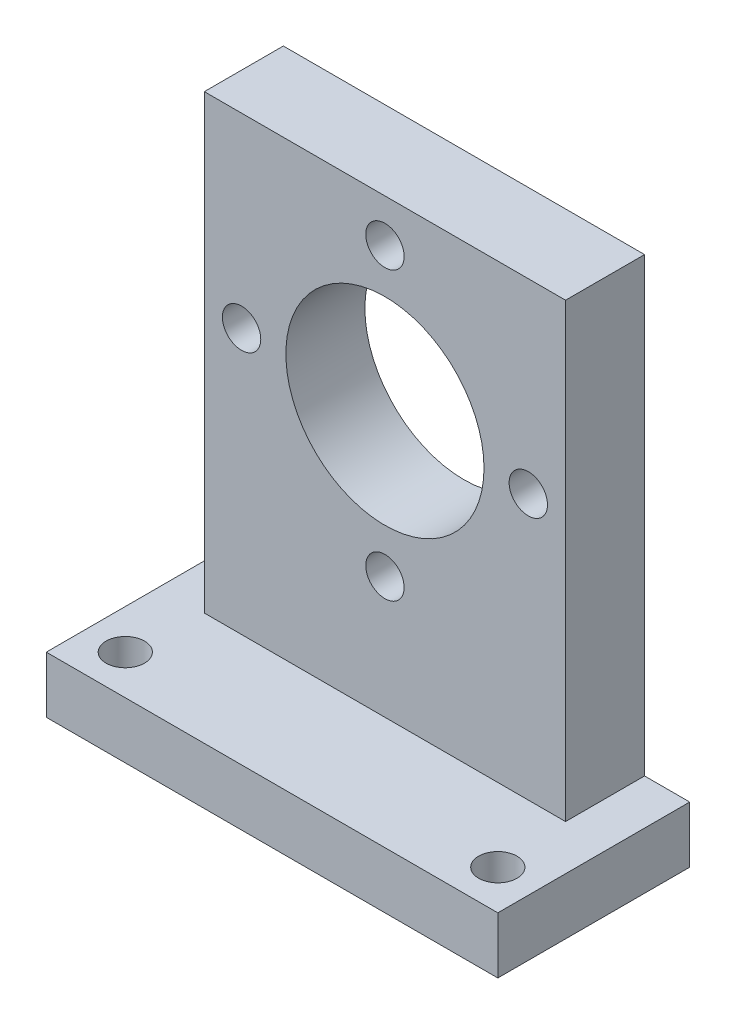
ISO-10303-21;
HEADER;
FILE_DESCRIPTION(('STEP AP214'),'2;1');
FILE_NAME('part.step','',(''),(''),'','','');
FILE_SCHEMA(('AUTOMOTIVE_DESIGN { 1 0 10303 214 1 1 1 1 }'));
ENDSEC;
DATA;
#1=APPLICATION_CONTEXT('core data for automotive mechanical design processes');
#2=APPLICATION_PROTOCOL_DEFINITION('international standard','automotive_design',2000,#1);
#3=PRODUCT_CONTEXT('',#1,'mechanical');
#4=PRODUCT('Part','Part','',(#3));
#5=PRODUCT_RELATED_PRODUCT_CATEGORY('part','',(#4));
#6=PRODUCT_DEFINITION_FORMATION('','',#4);
#7=PRODUCT_DEFINITION_CONTEXT('part definition',#1,'design');
#8=PRODUCT_DEFINITION('design','',#6,#7);
#9=PRODUCT_DEFINITION_SHAPE('','',#8);
#10=(LENGTH_UNIT() NAMED_UNIT(*) SI_UNIT(.MILLI.,.METRE.));
#11=(NAMED_UNIT(*) PLANE_ANGLE_UNIT() SI_UNIT($,.RADIAN.));
#12=(NAMED_UNIT(*) SI_UNIT($,.STERADIAN.) SOLID_ANGLE_UNIT());
#13=UNCERTAINTY_MEASURE_WITH_UNIT(LENGTH_MEASURE(1.E-05),#10,'distance_accuracy_value','');
#14=(GEOMETRIC_REPRESENTATION_CONTEXT(3) GLOBAL_UNCERTAINTY_ASSIGNED_CONTEXT((#13)) GLOBAL_UNIT_ASSIGNED_CONTEXT((#10,
#11,#12)) REPRESENTATION_CONTEXT('',''));
#15=CARTESIAN_POINT('',(0.,0.,0.));
#16=DIRECTION('',(0.,0.,1.));
#17=DIRECTION('',(1.,0.,0.));
#18=AXIS2_PLACEMENT_3D('',#15,#16,#17);
#19=CARTESIAN_POINT('',(-20.,5.,13.5));
#20=DIRECTION('',(0.,0.,-1.));
#21=DIRECTION('',(-1.,0.,0.));
#22=AXIS2_PLACEMENT_3D('',#19,#20,#21);
#23=PLANE('',#22);
#24=DIRECTION('',(1.,0.,0.));
#25=VECTOR('',#24,1.);
#26=CARTESIAN_POINT('',(-20.,0.,13.5));
#27=LINE('',#26,#25);
#28=CARTESIAN_POINT('',(-20.,0.,13.5));
#29=VERTEX_POINT('',#28);
#30=CARTESIAN_POINT('',(20.,0.,13.5));
#31=VERTEX_POINT('',#30);
#32=EDGE_CURVE('E121',#29,#31,#27,.T.);
#33=ORIENTED_EDGE('',*,*,#32,.T.);
#34=DIRECTION('',(0.,-1.,0.));
#35=VECTOR('',#34,1.);
#36=CARTESIAN_POINT('',(20.,5.,13.5));
#37=LINE('',#36,#35);
#38=CARTESIAN_POINT('',(20.,5.,13.5));
#39=VERTEX_POINT('',#38);
#40=EDGE_CURVE('E12',#39,#31,#37,.T.);
#41=ORIENTED_EDGE('',*,*,#40,.F.);
#42=DIRECTION('',(1.,0.,0.));
#43=VECTOR('',#42,1.);
#44=CARTESIAN_POINT('',(-20.,5.,13.5));
#45=LINE('',#44,#43);
#46=CARTESIAN_POINT('',(-20.,5.,13.5));
#47=VERTEX_POINT('',#46);
#48=EDGE_CURVE('E115',#47,#39,#45,.T.);
#49=ORIENTED_EDGE('',*,*,#48,.F.);
#50=DIRECTION('',(0.,-1.,0.));
#51=VECTOR('',#50,1.);
#52=CARTESIAN_POINT('',(-20.,5.,13.5));
#53=LINE('',#52,#51);
#54=EDGE_CURVE('E75',#47,#29,#53,.T.);
#55=ORIENTED_EDGE('',*,*,#54,.T.);
#56=EDGE_LOOP('',(#33,#41,#49,#55));
#57=FACE_BOUND('',#56,.T.);
#58=ADVANCED_FACE('F67',(#57),#23,.F.);
#59=CARTESIAN_POINT('',(20.,5.,-13.5));
#60=DIRECTION('',(1.,0.,0.));
#61=DIRECTION('',(0.,0.,-1.));
#62=AXIS2_PLACEMENT_3D('',#59,#60,#61);
#63=PLANE('',#62);
#64=DIRECTION('',(0.,1.,0.));
#65=VECTOR('',#64,1.);
#66=CARTESIAN_POINT('',(20.,-0.00100000000000013,-3.5));
#67=LINE('',#66,#65);
#68=CARTESIAN_POINT('',(20.,0.,-3.5));
#69=VERTEX_POINT('',#68);
#70=CARTESIAN_POINT('',(20.,5.,-3.5));
#71=VERTEX_POINT('',#70);
#72=EDGE_CURVE('E237',#69,#71,#67,.T.);
#73=ORIENTED_EDGE('',*,*,#72,.T.);
#74=DIRECTION('',(0.,0.,1.));
#75=VECTOR('',#74,1.);
#76=CARTESIAN_POINT('',(20.,5.,-13.5));
#77=LINE('',#76,#75);
#78=EDGE_CURVE('E136',#71,#39,#77,.T.);
#79=ORIENTED_EDGE('',*,*,#78,.T.);
#80=ORIENTED_EDGE('',*,*,#40,.T.);
#81=DIRECTION('',(0.,0.,1.));
#82=VECTOR('',#81,1.);
#83=CARTESIAN_POINT('',(20.,0.,-13.5));
#84=LINE('',#83,#82);
#85=EDGE_CURVE('E116',#69,#31,#84,.T.);
#86=ORIENTED_EDGE('',*,*,#85,.F.);
#87=EDGE_LOOP('',(#73,#79,#80,#86));
#88=FACE_BOUND('',#87,.T.);
#89=ADVANCED_FACE('F281',(#88),#63,.T.);
#90=CARTESIAN_POINT('',(-20.,5.,-13.5));
#91=DIRECTION('',(1.,0.,0.));
#92=DIRECTION('',(0.,0.,-1.));
#93=AXIS2_PLACEMENT_3D('',#90,#91,#92);
#94=PLANE('',#93);
#95=DIRECTION('',(0.,0.,1.));
#96=VECTOR('',#95,1.);
#97=CARTESIAN_POINT('',(-20.,5.,-13.5));
#98=LINE('',#97,#96);
#99=CARTESIAN_POINT('',(-20.,5.,-3.5));
#100=VERTEX_POINT('',#99);
#101=EDGE_CURVE('E90',#100,#47,#98,.T.);
#102=ORIENTED_EDGE('',*,*,#101,.F.);
#103=DIRECTION('',(0.,1.,0.));
#104=VECTOR('',#103,1.);
#105=CARTESIAN_POINT('',(-20.,-0.00100000000000013,-3.5));
#106=LINE('',#105,#104);
#107=CARTESIAN_POINT('',(-20.,0.,-3.5));
#108=VERTEX_POINT('',#107);
#109=EDGE_CURVE('E110',#108,#100,#106,.T.);
#110=ORIENTED_EDGE('',*,*,#109,.F.);
#111=DIRECTION('',(0.,0.,1.));
#112=VECTOR('',#111,1.);
#113=CARTESIAN_POINT('',(-20.,0.,-13.5));
#114=LINE('',#113,#112);
#115=EDGE_CURVE('E104',#108,#29,#114,.T.);
#116=ORIENTED_EDGE('',*,*,#115,.T.);
#117=ORIENTED_EDGE('',*,*,#54,.F.);
#118=EDGE_LOOP('',(#102,#110,#116,#117));
#119=FACE_BOUND('',#118,.T.);
#120=ADVANCED_FACE('F106',(#119),#94,.F.);
#121=CARTESIAN_POINT('',(0.,5.,0.));
#122=DIRECTION('',(0.,-1.,0.));
#123=DIRECTION('',(0.,0.,-1.));
#124=AXIS2_PLACEMENT_3D('',#121,#122,#123);
#125=PLANE('',#124);
#126=CARTESIAN_POINT('',(16.5,5.,10.));
#127=DIRECTION('',(0.,1.,0.));
#128=DIRECTION('',(0.,0.,-1.));
#129=AXIS2_PLACEMENT_3D('',#126,#127,#128);
#130=CIRCLE('',#129,1.7);
#131=CARTESIAN_POINT('',(16.5,5.,8.3));
#132=VERTEX_POINT('',#131);
#133=EDGE_CURVE('E219',#132,#132,#130,.T.);
#134=ORIENTED_EDGE('',*,*,#133,.F.);
#135=EDGE_LOOP('',(#134));
#136=FACE_BOUND('',#135,.T.);
#137=CARTESIAN_POINT('',(-16.5,5.,10.));
#138=DIRECTION('',(0.,1.,0.));
#139=DIRECTION('',(0.,0.,1.));
#140=AXIS2_PLACEMENT_3D('',#137,#138,#139);
#141=CIRCLE('',#140,1.7);
#142=CARTESIAN_POINT('',(-16.5,5.,11.7));
#143=VERTEX_POINT('',#142);
#144=EDGE_CURVE('E228',#143,#143,#141,.T.);
#145=ORIENTED_EDGE('',*,*,#144,.F.);
#146=EDGE_LOOP('',(#145));
#147=FACE_BOUND('',#146,.T.);
#148=ORIENTED_EDGE('',*,*,#78,.F.);
#149=DIRECTION('',(1.,0.,0.));
#150=VECTOR('',#149,1.);
#151=CARTESIAN_POINT('',(-20.,5.,-3.5));
#152=LINE('',#151,#150);
#153=CARTESIAN_POINT('',(16.,5.,-3.5));
#154=VERTEX_POINT('',#153);
#155=EDGE_CURVE('E247',#154,#71,#152,.T.);
#156=ORIENTED_EDGE('',*,*,#155,.F.);
#157=DIRECTION('',(0.,0.,1.));
#158=VECTOR('',#157,1.);
#159=CARTESIAN_POINT('',(16.,5.,0.));
#160=LINE('',#159,#158);
#161=CARTESIAN_POINT('',(16.,5.00000000000001,3.5));
#162=VERTEX_POINT('',#161);
#163=EDGE_CURVE('E143',#154,#162,#160,.T.);
#164=ORIENTED_EDGE('',*,*,#163,.T.);
#165=DIRECTION('',(1.,0.,0.));
#166=VECTOR('',#165,1.);
#167=CARTESIAN_POINT('',(0.,5.,3.5));
#168=LINE('',#167,#166);
#169=CARTESIAN_POINT('',(-16.,5.,3.5));
#170=VERTEX_POINT('',#169);
#171=EDGE_CURVE('E82',#170,#162,#168,.T.);
#172=ORIENTED_EDGE('',*,*,#171,.F.);
#173=DIRECTION('',(0.,0.,1.));
#174=VECTOR('',#173,1.);
#175=CARTESIAN_POINT('',(-16.,5.,0.));
#176=LINE('',#175,#174);
#177=CARTESIAN_POINT('',(-16.,5.,-3.5));
#178=VERTEX_POINT('',#177);
#179=EDGE_CURVE('E131',#178,#170,#176,.T.);
#180=ORIENTED_EDGE('',*,*,#179,.F.);
#181=EDGE_CURVE('E240',#100,#178,#152,.T.);
#182=ORIENTED_EDGE('',*,*,#181,.F.);
#183=ORIENTED_EDGE('',*,*,#101,.T.);
#184=ORIENTED_EDGE('',*,*,#48,.T.);
#185=EDGE_LOOP('',(#148,#156,#164,#172,#180,#182,#183,#184));
#186=FACE_BOUND('',#185,.T.);
#187=ADVANCED_FACE('F282',(#136,#147,#186),#125,.F.);
#188=CARTESIAN_POINT('',(0.,0.,0.));
#189=DIRECTION('',(0.,-1.,0.));
#190=DIRECTION('',(0.,0.,-1.));
#191=AXIS2_PLACEMENT_3D('',#188,#189,#190);
#192=PLANE('',#191);
#193=DIRECTION('',(1.,0.,0.));
#194=VECTOR('',#193,1.);
#195=CARTESIAN_POINT('',(-20.,0.,-3.5));
#196=LINE('',#195,#194);
#197=EDGE_CURVE('E224',#108,#69,#196,.T.);
#198=ORIENTED_EDGE('',*,*,#197,.T.);
#199=ORIENTED_EDGE('',*,*,#85,.T.);
#200=ORIENTED_EDGE('',*,*,#32,.F.);
#201=ORIENTED_EDGE('',*,*,#115,.F.);
#202=EDGE_LOOP('',(#198,#199,#200,#201));
#203=FACE_BOUND('',#202,.T.);
#204=CARTESIAN_POINT('',(16.5,0.,10.));
#205=DIRECTION('',(0.,-1.,0.));
#206=DIRECTION('',(0.,0.,-1.));
#207=AXIS2_PLACEMENT_3D('',#204,#205,#206);
#208=CIRCLE('',#207,1.7);
#209=CARTESIAN_POINT('',(16.5,0.,8.3));
#210=VERTEX_POINT('',#209);
#211=EDGE_CURVE('E223',#210,#210,#208,.F.);
#212=ORIENTED_EDGE('',*,*,#211,.T.);
#213=EDGE_LOOP('',(#212));
#214=FACE_BOUND('',#213,.T.);
#215=CARTESIAN_POINT('',(-16.5,0.,10.));
#216=DIRECTION('',(0.,-1.,0.));
#217=DIRECTION('',(0.,0.,-1.));
#218=AXIS2_PLACEMENT_3D('',#215,#216,#217);
#219=CIRCLE('',#218,1.7);
#220=CARTESIAN_POINT('',(-16.5,0.,8.30000000000001));
#221=VERTEX_POINT('',#220);
#222=EDGE_CURVE('E192',#221,#221,#219,.F.);
#223=ORIENTED_EDGE('',*,*,#222,.T.);
#224=EDGE_LOOP('',(#223));
#225=FACE_BOUND('',#224,.T.);
#226=ADVANCED_FACE('F123',(#203,#214,#225),#192,.T.);
#227=CARTESIAN_POINT('',(0.,45.,-3.5));
#228=DIRECTION('',(0.,0.,-1.));
#229=DIRECTION('',(-1.,0.,0.));
#230=AXIS2_PLACEMENT_3D('',#227,#228,#229);
#231=PLANE('',#230);
#232=CARTESIAN_POINT('',(12.7000000000002,2.5,-3.5));
#233=DIRECTION('',(0.,0.,-1.));
#234=DIRECTION('',(-1.,0.,0.));
#235=AXIS2_PLACEMENT_3D('',#232,#233,#234);
#236=CIRCLE('',#235,1.7);
#237=CARTESIAN_POINT('',(11.0000000000002,2.5,-3.5));
#238=VERTEX_POINT('',#237);
#239=EDGE_CURVE('E256',#238,#238,#236,.T.);
#240=ORIENTED_EDGE('',*,*,#239,.F.);
#241=EDGE_LOOP('',(#240));
#242=FACE_BOUND('',#241,.T.);
#243=CARTESIAN_POINT('',(-12.7000000000002,2.5,-3.5));
#244=DIRECTION('',(0.,0.,-1.));
#245=DIRECTION('',(1.,0.,0.));
#246=AXIS2_PLACEMENT_3D('',#243,#244,#245);
#247=CIRCLE('',#246,1.7);
#248=CARTESIAN_POINT('',(-11.0000000000002,2.5,-3.5));
#249=VERTEX_POINT('',#248);
#250=EDGE_CURVE('E252',#249,#249,#247,.T.);
#251=ORIENTED_EDGE('',*,*,#250,.F.);
#252=EDGE_LOOP('',(#251));
#253=FACE_BOUND('',#252,.T.);
#254=CARTESIAN_POINT('',(0.,41.2,-3.5));
#255=DIRECTION('',(0.,0.,-1.));
#256=DIRECTION('',(-1.,0.,0.));
#257=AXIS2_PLACEMENT_3D('',#254,#255,#256);
#258=CIRCLE('',#257,1.7);
#259=CARTESIAN_POINT('',(-1.7,41.2,-3.5));
#260=VERTEX_POINT('',#259);
#261=EDGE_CURVE('E212',#260,#260,#258,.F.);
#262=ORIENTED_EDGE('',*,*,#261,.T.);
#263=EDGE_LOOP('',(#262));
#264=FACE_BOUND('',#263,.T.);
#265=CARTESIAN_POINT('',(12.7000000000002,28.5000000000001,-3.5));
#266=DIRECTION('',(0.,0.,-1.));
#267=DIRECTION('',(-1.,0.,0.));
#268=AXIS2_PLACEMENT_3D('',#265,#266,#267);
#269=CIRCLE('',#268,1.7);
#270=CARTESIAN_POINT('',(11.0000000000002,28.5000000000001,-3.5));
#271=VERTEX_POINT('',#270);
#272=EDGE_CURVE('E208',#271,#271,#269,.F.);
#273=ORIENTED_EDGE('',*,*,#272,.T.);
#274=EDGE_LOOP('',(#273));
#275=FACE_BOUND('',#274,.T.);
#276=CARTESIAN_POINT('',(2.66516243803523E-13,15.8,-3.5));
#277=DIRECTION('',(0.,0.,-1.));
#278=DIRECTION('',(-1.,0.,0.));
#279=AXIS2_PLACEMENT_3D('',#276,#277,#278);
#280=CIRCLE('',#279,1.7);
#281=CARTESIAN_POINT('',(-1.69999999999973,15.8,-3.5));
#282=VERTEX_POINT('',#281);
#283=EDGE_CURVE('E200',#282,#282,#280,.F.);
#284=ORIENTED_EDGE('',*,*,#283,.T.);
#285=EDGE_LOOP('',(#284));
#286=FACE_BOUND('',#285,.T.);
#287=CARTESIAN_POINT('',(-12.6999999999998,28.5,-3.5));
#288=DIRECTION('',(0.,0.,-1.));
#289=DIRECTION('',(-1.,0.,0.));
#290=AXIS2_PLACEMENT_3D('',#287,#288,#289);
#291=CIRCLE('',#290,1.7);
#292=CARTESIAN_POINT('',(-14.3999999999998,28.5,-3.5));
#293=VERTEX_POINT('',#292);
#294=EDGE_CURVE('E191',#293,#293,#291,.F.);
#295=ORIENTED_EDGE('',*,*,#294,.T.);
#296=EDGE_LOOP('',(#295));
#297=FACE_BOUND('',#296,.T.);
#298=CARTESIAN_POINT('',(0.,28.5,-3.5));
#299=DIRECTION('',(0.,0.,-1.));
#300=DIRECTION('',(-1.,0.,0.));
#301=AXIS2_PLACEMENT_3D('',#298,#299,#300);
#302=CIRCLE('',#301,8.7757);
#303=CARTESIAN_POINT('',(-8.7757,28.5,-3.5));
#304=VERTEX_POINT('',#303);
#305=EDGE_CURVE('E179',#304,#304,#302,.F.);
#306=ORIENTED_EDGE('',*,*,#305,.T.);
#307=EDGE_LOOP('',(#306));
#308=FACE_BOUND('',#307,.T.);
#309=DIRECTION('',(0.,-1.,0.));
#310=VECTOR('',#309,1.);
#311=CARTESIAN_POINT('',(16.,45.,-3.5));
#312=LINE('',#311,#310);
#313=CARTESIAN_POINT('',(16.,45.,-3.5));
#314=VERTEX_POINT('',#313);
#315=EDGE_CURVE('E146',#314,#154,#312,.T.);
#316=ORIENTED_EDGE('',*,*,#315,.T.);
#317=ORIENTED_EDGE('',*,*,#155,.T.);
#318=ORIENTED_EDGE('',*,*,#72,.F.);
#319=ORIENTED_EDGE('',*,*,#197,.F.);
#320=ORIENTED_EDGE('',*,*,#109,.T.);
#321=ORIENTED_EDGE('',*,*,#181,.T.);
#322=DIRECTION('',(0.,-1.,0.));
#323=VECTOR('',#322,1.);
#324=CARTESIAN_POINT('',(-16.,45.,-3.5));
#325=LINE('',#324,#323);
#326=CARTESIAN_POINT('',(-16.,45.,-3.5));
#327=VERTEX_POINT('',#326);
#328=EDGE_CURVE('E150',#327,#178,#325,.T.);
#329=ORIENTED_EDGE('',*,*,#328,.F.);
#330=DIRECTION('',(1.,0.,0.));
#331=VECTOR('',#330,1.);
#332=CARTESIAN_POINT('',(0.,45.,-3.5));
#333=LINE('',#332,#331);
#334=EDGE_CURVE('E170',#327,#314,#333,.T.);
#335=ORIENTED_EDGE('',*,*,#334,.T.);
#336=EDGE_LOOP('',(#316,#317,#318,#319,#320,#321,#329,#335));
#337=FACE_BOUND('',#336,.T.);
#338=ADVANCED_FACE('F271',(#242,#253,#264,#275,#286,#297,#308,#337),#231,.T.);
#339=CARTESIAN_POINT('',(0.,45.,3.5));
#340=DIRECTION('',(0.,0.,-1.));
#341=DIRECTION('',(-1.,0.,0.));
#342=AXIS2_PLACEMENT_3D('',#339,#340,#341);
#343=PLANE('',#342);
#344=CARTESIAN_POINT('',(0.,41.2,3.5));
#345=DIRECTION('',(0.,0.,1.));
#346=DIRECTION('',(1.,0.,0.));
#347=AXIS2_PLACEMENT_3D('',#344,#345,#346);
#348=CIRCLE('',#347,1.7);
#349=CARTESIAN_POINT('',(1.7,41.2,3.5));
#350=VERTEX_POINT('',#349);
#351=EDGE_CURVE('E183',#350,#350,#348,.T.);
#352=ORIENTED_EDGE('',*,*,#351,.F.);
#353=EDGE_LOOP('',(#352));
#354=FACE_BOUND('',#353,.T.);
#355=CARTESIAN_POINT('',(12.7000000000002,28.5000000000001,3.5));
#356=DIRECTION('',(0.,0.,1.));
#357=DIRECTION('',(1.,0.,0.));
#358=AXIS2_PLACEMENT_3D('',#355,#356,#357);
#359=CIRCLE('',#358,1.7);
#360=CARTESIAN_POINT('',(14.4000000000002,28.5000000000001,3.5));
#361=VERTEX_POINT('',#360);
#362=EDGE_CURVE('E204',#361,#361,#359,.T.);
#363=ORIENTED_EDGE('',*,*,#362,.F.);
#364=EDGE_LOOP('',(#363));
#365=FACE_BOUND('',#364,.T.);
#366=CARTESIAN_POINT('',(2.66516243803523E-13,15.8,3.5));
#367=DIRECTION('',(0.,0.,1.));
#368=DIRECTION('',(1.,0.,0.));
#369=AXIS2_PLACEMENT_3D('',#366,#367,#368);
#370=CIRCLE('',#369,1.7);
#371=CARTESIAN_POINT('',(1.70000000000027,15.8,3.5));
#372=VERTEX_POINT('',#371);
#373=EDGE_CURVE('E196',#372,#372,#370,.T.);
#374=ORIENTED_EDGE('',*,*,#373,.F.);
#375=EDGE_LOOP('',(#374));
#376=FACE_BOUND('',#375,.T.);
#377=CARTESIAN_POINT('',(-12.6999999999998,28.5,3.5));
#378=DIRECTION('',(0.,0.,1.));
#379=DIRECTION('',(1.,0.,0.));
#380=AXIS2_PLACEMENT_3D('',#377,#378,#379);
#381=CIRCLE('',#380,1.7);
#382=CARTESIAN_POINT('',(-10.9999999999998,28.5,3.5));
#383=VERTEX_POINT('',#382);
#384=EDGE_CURVE('E187',#383,#383,#381,.T.);
#385=ORIENTED_EDGE('',*,*,#384,.F.);
#386=EDGE_LOOP('',(#385));
#387=FACE_BOUND('',#386,.T.);
#388=CARTESIAN_POINT('',(0.,28.5,3.5));
#389=DIRECTION('',(0.,0.,1.));
#390=DIRECTION('',(1.,0.,0.));
#391=AXIS2_PLACEMENT_3D('',#388,#389,#390);
#392=CIRCLE('',#391,8.7757);
#393=CARTESIAN_POINT('',(8.7757,28.5,3.5));
#394=VERTEX_POINT('',#393);
#395=EDGE_CURVE('E178',#394,#394,#392,.T.);
#396=ORIENTED_EDGE('',*,*,#395,.F.);
#397=EDGE_LOOP('',(#396));
#398=FACE_BOUND('',#397,.T.);
#399=DIRECTION('',(0.,-1.,0.));
#400=VECTOR('',#399,1.);
#401=CARTESIAN_POINT('',(-16.,45.,3.5));
#402=LINE('',#401,#400);
#403=CARTESIAN_POINT('',(-16.,45.,3.5));
#404=VERTEX_POINT('',#403);
#405=EDGE_CURVE('E154',#404,#170,#402,.T.);
#406=ORIENTED_EDGE('',*,*,#405,.T.);
#407=ORIENTED_EDGE('',*,*,#171,.T.);
#408=DIRECTION('',(0.,-1.,0.));
#409=VECTOR('',#408,1.);
#410=CARTESIAN_POINT('',(16.,45.,3.5));
#411=LINE('',#410,#409);
#412=CARTESIAN_POINT('',(16.,45.,3.5));
#413=VERTEX_POINT('',#412);
#414=EDGE_CURVE('E158',#413,#162,#411,.T.);
#415=ORIENTED_EDGE('',*,*,#414,.F.);
#416=DIRECTION('',(1.,0.,0.));
#417=VECTOR('',#416,1.);
#418=CARTESIAN_POINT('',(0.,45.,3.5));
#419=LINE('',#418,#417);
#420=EDGE_CURVE('E162',#404,#413,#419,.T.);
#421=ORIENTED_EDGE('',*,*,#420,.F.);
#422=EDGE_LOOP('',(#406,#407,#415,#421));
#423=FACE_BOUND('',#422,.T.);
#424=ADVANCED_FACE('F332',(#354,#365,#376,#387,#398,#423),#343,.F.);
#425=CARTESIAN_POINT('',(16.,45.,0.));
#426=DIRECTION('',(1.,0.,0.));
#427=DIRECTION('',(0.,0.,-1.));
#428=AXIS2_PLACEMENT_3D('',#425,#426,#427);
#429=PLANE('',#428);
#430=ORIENTED_EDGE('',*,*,#163,.F.);
#431=ORIENTED_EDGE('',*,*,#315,.F.);
#432=DIRECTION('',(0.,0.,1.));
#433=VECTOR('',#432,1.);
#434=CARTESIAN_POINT('',(16.,45.,0.));
#435=LINE('',#434,#433);
#436=EDGE_CURVE('E174',#314,#413,#435,.T.);
#437=ORIENTED_EDGE('',*,*,#436,.T.);
#438=ORIENTED_EDGE('',*,*,#414,.T.);
#439=EDGE_LOOP('',(#430,#431,#437,#438));
#440=FACE_BOUND('',#439,.T.);
#441=ADVANCED_FACE('F326',(#440),#429,.T.);
#442=CARTESIAN_POINT('',(-16.,45.,0.));
#443=DIRECTION('',(1.,0.,0.));
#444=DIRECTION('',(0.,0.,-1.));
#445=AXIS2_PLACEMENT_3D('',#442,#443,#444);
#446=PLANE('',#445);
#447=ORIENTED_EDGE('',*,*,#328,.T.);
#448=ORIENTED_EDGE('',*,*,#179,.T.);
#449=ORIENTED_EDGE('',*,*,#405,.F.);
#450=DIRECTION('',(0.,0.,1.));
#451=VECTOR('',#450,1.);
#452=CARTESIAN_POINT('',(-16.,45.,0.));
#453=LINE('',#452,#451);
#454=EDGE_CURVE('E166',#327,#404,#453,.T.);
#455=ORIENTED_EDGE('',*,*,#454,.F.);
#456=EDGE_LOOP('',(#447,#448,#449,#455));
#457=FACE_BOUND('',#456,.T.);
#458=ADVANCED_FACE('F331',(#457),#446,.F.);
#459=CARTESIAN_POINT('',(0.,45.,0.));
#460=DIRECTION('',(0.,1.,0.));
#461=DIRECTION('',(0.,0.,1.));
#462=AXIS2_PLACEMENT_3D('',#459,#460,#461);
#463=PLANE('',#462);
#464=ORIENTED_EDGE('',*,*,#436,.F.);
#465=ORIENTED_EDGE('',*,*,#334,.F.);
#466=ORIENTED_EDGE('',*,*,#454,.T.);
#467=ORIENTED_EDGE('',*,*,#420,.T.);
#468=EDGE_LOOP('',(#464,#465,#466,#467));
#469=FACE_BOUND('',#468,.T.);
#470=ADVANCED_FACE('F344',(#469),#463,.T.);
#471=CARTESIAN_POINT('',(0.,28.5,-13.501));
#472=DIRECTION('',(0.,0.,1.));
#473=DIRECTION('',(1.,0.,0.));
#474=AXIS2_PLACEMENT_3D('',#471,#472,#473);
#475=CYLINDRICAL_SURFACE('',#474,8.7757);
#476=ORIENTED_EDGE('',*,*,#305,.F.);
#477=EDGE_LOOP('',(#476));
#478=FACE_BOUND('',#477,.T.);
#479=ORIENTED_EDGE('',*,*,#395,.T.);
#480=EDGE_LOOP('',(#479));
#481=FACE_BOUND('',#480,.T.);
#482=ADVANCED_FACE('F462',(#478,#481),#475,.F.);
#483=CARTESIAN_POINT('',(-12.6999999999998,28.5,-13.501));
#484=DIRECTION('',(0.,0.,1.));
#485=DIRECTION('',(1.,0.,0.));
#486=AXIS2_PLACEMENT_3D('',#483,#484,#485);
#487=CYLINDRICAL_SURFACE('',#486,1.7);
#488=ORIENTED_EDGE('',*,*,#294,.F.);
#489=EDGE_LOOP('',(#488));
#490=FACE_BOUND('',#489,.T.);
#491=ORIENTED_EDGE('',*,*,#384,.T.);
#492=EDGE_LOOP('',(#491));
#493=FACE_BOUND('',#492,.T.);
#494=ADVANCED_FACE('F452',(#490,#493),#487,.F.);
#495=CARTESIAN_POINT('',(2.66516243803523E-13,15.8,-13.501));
#496=DIRECTION('',(0.,0.,1.));
#497=DIRECTION('',(1.,0.,0.));
#498=AXIS2_PLACEMENT_3D('',#495,#496,#497);
#499=CYLINDRICAL_SURFACE('',#498,1.7);
#500=ORIENTED_EDGE('',*,*,#283,.F.);
#501=EDGE_LOOP('',(#500));
#502=FACE_BOUND('',#501,.T.);
#503=ORIENTED_EDGE('',*,*,#373,.T.);
#504=EDGE_LOOP('',(#503));
#505=FACE_BOUND('',#504,.T.);
#506=ADVANCED_FACE('F442',(#502,#505),#499,.F.);
#507=CARTESIAN_POINT('',(12.7000000000002,28.5000000000001,-13.501));
#508=DIRECTION('',(0.,0.,1.));
#509=DIRECTION('',(1.,0.,0.));
#510=AXIS2_PLACEMENT_3D('',#507,#508,#509);
#511=CYLINDRICAL_SURFACE('',#510,1.7);
#512=ORIENTED_EDGE('',*,*,#272,.F.);
#513=EDGE_LOOP('',(#512));
#514=FACE_BOUND('',#513,.T.);
#515=ORIENTED_EDGE('',*,*,#362,.T.);
#516=EDGE_LOOP('',(#515));
#517=FACE_BOUND('',#516,.T.);
#518=ADVANCED_FACE('F432',(#514,#517),#511,.F.);
#519=CARTESIAN_POINT('',(0.,41.2,-13.501));
#520=DIRECTION('',(0.,0.,1.));
#521=DIRECTION('',(1.,0.,0.));
#522=AXIS2_PLACEMENT_3D('',#519,#520,#521);
#523=CYLINDRICAL_SURFACE('',#522,1.7);
#524=ORIENTED_EDGE('',*,*,#261,.F.);
#525=EDGE_LOOP('',(#524));
#526=FACE_BOUND('',#525,.T.);
#527=ORIENTED_EDGE('',*,*,#351,.T.);
#528=EDGE_LOOP('',(#527));
#529=FACE_BOUND('',#528,.T.);
#530=ADVANCED_FACE('F422',(#526,#529),#523,.F.);
#531=CARTESIAN_POINT('',(-16.5,-0.00100000000000013,10.));
#532=DIRECTION('',(0.,1.,0.));
#533=DIRECTION('',(0.,0.,1.));
#534=AXIS2_PLACEMENT_3D('',#531,#532,#533);
#535=CYLINDRICAL_SURFACE('',#534,1.7);
#536=ORIENTED_EDGE('',*,*,#222,.F.);
#537=EDGE_LOOP('',(#536));
#538=FACE_BOUND('',#537,.T.);
#539=ORIENTED_EDGE('',*,*,#144,.T.);
#540=EDGE_LOOP('',(#539));
#541=FACE_BOUND('',#540,.T.);
#542=ADVANCED_FACE('F413',(#538,#541),#535,.F.);
#543=CARTESIAN_POINT('',(16.5,-0.00100000000000013,10.));
#544=DIRECTION('',(0.,1.,0.));
#545=DIRECTION('',(0.,0.,1.));
#546=AXIS2_PLACEMENT_3D('',#543,#544,#545);
#547=CYLINDRICAL_SURFACE('',#546,1.7);
#548=ORIENTED_EDGE('',*,*,#211,.F.);
#549=EDGE_LOOP('',(#548));
#550=FACE_BOUND('',#549,.T.);
#551=ORIENTED_EDGE('',*,*,#133,.T.);
#552=EDGE_LOOP('',(#551));
#553=FACE_BOUND('',#552,.T.);
#554=ADVANCED_FACE('F368',(#550,#553),#547,.F.);
#555=CARTESIAN_POINT('',(-12.7000000000002,2.5,2.85));
#556=DIRECTION('',(0.,0.,-1.));
#557=DIRECTION('',(-1.,0.,0.));
#558=AXIS2_PLACEMENT_3D('',#555,#556,#557);
#559=CYLINDRICAL_SURFACE('',#558,1.7);
#560=CARTESIAN_POINT('',(-12.7000000000002,2.5,2.85));
#561=DIRECTION('',(0.,0.,-1.));
#562=DIRECTION('',(1.,0.,0.));
#563=AXIS2_PLACEMENT_3D('',#560,#561,#562);
#564=CIRCLE('',#563,1.7);
#565=CARTESIAN_POINT('',(-11.0000000000002,2.5,2.85));
#566=VERTEX_POINT('',#565);
#567=EDGE_CURVE('E248',#566,#566,#564,.T.);
#568=ORIENTED_EDGE('',*,*,#567,.F.);
#569=EDGE_LOOP('',(#568));
#570=FACE_BOUND('',#569,.T.);
#571=ORIENTED_EDGE('',*,*,#250,.T.);
#572=EDGE_LOOP('',(#571));
#573=FACE_BOUND('',#572,.T.);
#574=ADVANCED_FACE('F363',(#570,#573),#559,.F.);
#575=CARTESIAN_POINT('',(-12.7000000000002,2.5,2.85));
#576=DIRECTION('',(0.,0.,1.));
#577=DIRECTION('',(1.,0.,0.));
#578=AXIS2_PLACEMENT_3D('',#575,#576,#577);
#579=PLANE('',#578);
#580=ORIENTED_EDGE('',*,*,#567,.T.);
#581=EDGE_LOOP('',(#580));
#582=FACE_BOUND('',#581,.T.);
#583=ADVANCED_FACE('F367',(#582),#579,.F.);
#584=CARTESIAN_POINT('',(12.7000000000002,2.5,2.85));
#585=DIRECTION('',(0.,0.,-1.));
#586=DIRECTION('',(-1.,0.,0.));
#587=AXIS2_PLACEMENT_3D('',#584,#585,#586);
#588=CYLINDRICAL_SURFACE('',#587,1.7);
#589=CARTESIAN_POINT('',(12.7000000000002,2.5,2.85));
#590=DIRECTION('',(0.,0.,-1.));
#591=DIRECTION('',(-1.,0.,0.));
#592=AXIS2_PLACEMENT_3D('',#589,#590,#591);
#593=CIRCLE('',#592,1.7);
#594=CARTESIAN_POINT('',(11.0000000000002,2.5,2.85));
#595=VERTEX_POINT('',#594);
#596=EDGE_CURVE('E260',#595,#595,#593,.T.);
#597=ORIENTED_EDGE('',*,*,#596,.F.);
#598=EDGE_LOOP('',(#597));
#599=FACE_BOUND('',#598,.T.);
#600=ORIENTED_EDGE('',*,*,#239,.T.);
#601=EDGE_LOOP('',(#600));
#602=FACE_BOUND('',#601,.T.);
#603=ADVANCED_FACE('F380',(#599,#602),#588,.F.);
#604=CARTESIAN_POINT('',(12.7000000000002,2.5,2.85));
#605=DIRECTION('',(0.,0.,-1.));
#606=DIRECTION('',(-1.,0.,0.));
#607=AXIS2_PLACEMENT_3D('',#604,#605,#606);
#608=PLANE('',#607);
#609=ORIENTED_EDGE('',*,*,#596,.T.);
#610=EDGE_LOOP('',(#609));
#611=FACE_BOUND('',#610,.T.);
#612=ADVANCED_FACE('F391',(#611),#608,.T.);
#613=CLOSED_SHELL('',(#58,#89,#120,#187,#226,#338,#424,#441,#458,#470,#482,#494,#506,#518,#530,
#542,#554,#574,#583,#603,#612));
#614=MANIFOLD_SOLID_BREP('B2',#613);
#615=ADVANCED_BREP_SHAPE_REPRESENTATION('',(#18,#614),#14);
#616=SHAPE_DEFINITION_REPRESENTATION(#9,#615);
ENDSEC;
END-ISO-10303-21;
